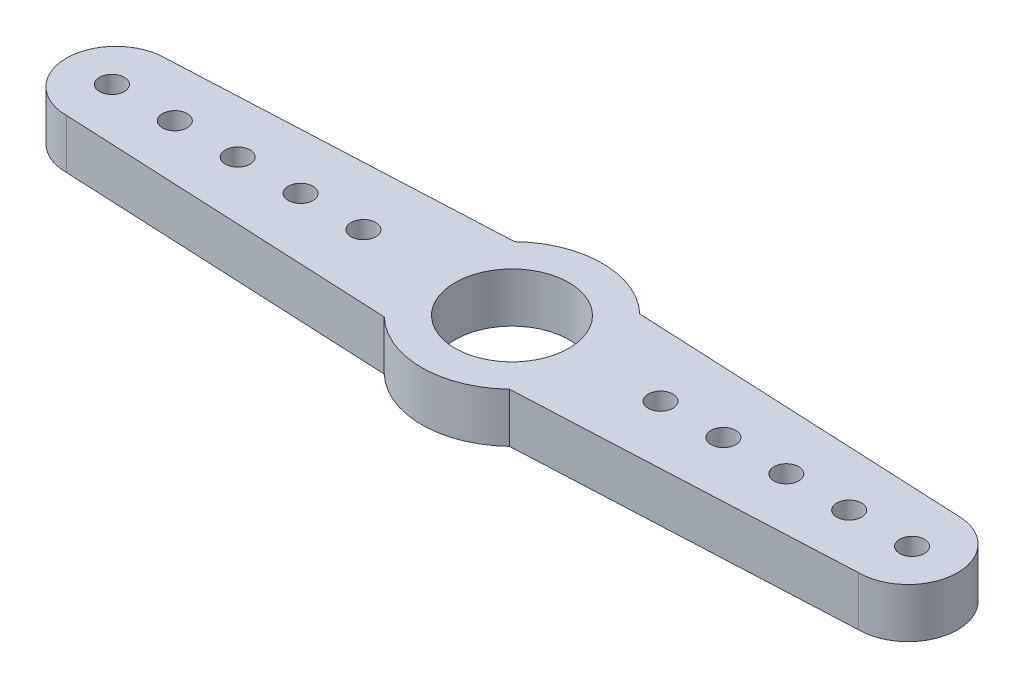
ISO-10303-21;
HEADER;
FILE_DESCRIPTION(('STEP AP214'),'2;1');
FILE_NAME('part.step','',(''),(''),'','','');
FILE_SCHEMA(('AUTOMOTIVE_DESIGN { 1 0 10303 214 1 1 1 1 }'));
ENDSEC;
DATA;
#1=APPLICATION_CONTEXT('core data for automotive mechanical design processes');
#2=APPLICATION_PROTOCOL_DEFINITION('international standard','automotive_design',2000,#1);
#3=PRODUCT_CONTEXT('',#1,'mechanical');
#4=PRODUCT('Part','Part','',(#3));
#5=PRODUCT_RELATED_PRODUCT_CATEGORY('part','',(#4));
#6=PRODUCT_DEFINITION_FORMATION('','',#4);
#7=PRODUCT_DEFINITION_CONTEXT('part definition',#1,'design');
#8=PRODUCT_DEFINITION('design','',#6,#7);
#9=PRODUCT_DEFINITION_SHAPE('','',#8);
#10=(LENGTH_UNIT() NAMED_UNIT(*) SI_UNIT(.MILLI.,.METRE.));
#11=(NAMED_UNIT(*) PLANE_ANGLE_UNIT() SI_UNIT($,.RADIAN.));
#12=(NAMED_UNIT(*) SI_UNIT($,.STERADIAN.) SOLID_ANGLE_UNIT());
#13=UNCERTAINTY_MEASURE_WITH_UNIT(LENGTH_MEASURE(1.E-05),#10,'distance_accuracy_value','');
#14=(GEOMETRIC_REPRESENTATION_CONTEXT(3) GLOBAL_UNCERTAINTY_ASSIGNED_CONTEXT((#13)) GLOBAL_UNIT_ASSIGNED_CONTEXT((#10,
#11,#12)) REPRESENTATION_CONTEXT('',''));
#15=CARTESIAN_POINT('',(0.,0.,0.));
#16=DIRECTION('',(0.,0.,1.));
#17=DIRECTION('',(1.,0.,0.));
#18=AXIS2_PLACEMENT_3D('',#15,#16,#17);
#19=CARTESIAN_POINT('',(-16.,2.,0.));
#20=DIRECTION('',(0.,-1.,0.));
#21=DIRECTION('',(0.,0.,-1.));
#22=AXIS2_PLACEMENT_3D('',#19,#20,#21);
#23=PLANE('',#22);
#24=CARTESIAN_POINT('',(-16.,2.,0.));
#25=DIRECTION('',(0.,1.,0.));
#26=DIRECTION('',(0.,0.,-1.));
#27=AXIS2_PLACEMENT_3D('',#24,#25,#26);
#28=CIRCLE('',#27,2.);
#29=CARTESIAN_POINT('',(-16.,2.,-2.));
#30=VERTEX_POINT('',#29);
#31=CARTESIAN_POINT('',(-16.,2.,2.));
#32=VERTEX_POINT('',#31);
#33=EDGE_CURVE('E170',#30,#32,#28,.T.);
#34=ORIENTED_EDGE('',*,*,#33,.T.);
#35=DIRECTION('',(0.998899457110281,0.,0.0469028206485118));
#36=VECTOR('',#35,1.);
#37=CARTESIAN_POINT('',(-16.,2.,2.));
#38=LINE('',#37,#36);
#39=CARTESIAN_POINT('',(-2.52848651409341,2.,2.63254812723732));
#40=VERTEX_POINT('',#39);
#41=EDGE_CURVE('E106',#32,#40,#38,.T.);
#42=ORIENTED_EDGE('',*,*,#41,.T.);
#43=CARTESIAN_POINT('',(1.25171845544864E-09,2.,0.000200136997831595));
#44=DIRECTION('',(0.,1.,0.));
#45=DIRECTION('',(0.,0.,1.));
#46=AXIS2_PLACEMENT_3D('',#43,#44,#45);
#47=CIRCLE('',#46,3.65);
#48=CARTESIAN_POINT('',(2.52848651672551,2.,2.63254812711373));
#49=VERTEX_POINT('',#48);
#50=EDGE_CURVE('E191',#40,#49,#47,.T.);
#51=ORIENTED_EDGE('',*,*,#50,.T.);
#52=DIRECTION('',(0.998899457110281,0.,-0.0469028206485114));
#53=VECTOR('',#52,1.);
#54=CARTESIAN_POINT('',(2.52848651672551,2.,2.63254812711373));
#55=LINE('',#54,#53);
#56=CARTESIAN_POINT('',(16.,2.,2.));
#57=VERTEX_POINT('',#56);
#58=EDGE_CURVE('E205',#49,#57,#55,.T.);
#59=ORIENTED_EDGE('',*,*,#58,.T.);
#60=CARTESIAN_POINT('',(16.,2.,0.));
#61=DIRECTION('',(0.,1.,0.));
#62=DIRECTION('',(0.,0.,-1.));
#63=AXIS2_PLACEMENT_3D('',#60,#61,#62);
#64=CIRCLE('',#63,2.);
#65=CARTESIAN_POINT('',(16.,2.,-2.));
#66=VERTEX_POINT('',#65);
#67=EDGE_CURVE('E125',#57,#66,#64,.T.);
#68=ORIENTED_EDGE('',*,*,#67,.T.);
#69=DIRECTION('',(-0.998899457110281,0.,-0.0469028206485115));
#70=VECTOR('',#69,1.);
#71=CARTESIAN_POINT('',(16.,2.,-2.));
#72=LINE('',#71,#70);
#73=CARTESIAN_POINT('',(2.52804830674604,2.,-2.63256870304249));
#74=VERTEX_POINT('',#73);
#75=EDGE_CURVE('E119',#66,#74,#72,.T.);
#76=ORIENTED_EDGE('',*,*,#75,.T.);
#77=CARTESIAN_POINT('',(1.25171845544864E-09,2.,0.000200136997831595));
#78=DIRECTION('',(0.,1.,0.));
#79=DIRECTION('',(0.,0.,1.));
#80=AXIS2_PLACEMENT_3D('',#77,#78,#79);
#81=CIRCLE('',#80,3.65);
#82=CARTESIAN_POINT('',(-2.52804830411389,2.,-2.63256870316608));
#83=VERTEX_POINT('',#82);
#84=EDGE_CURVE('E123',#74,#83,#81,.T.);
#85=ORIENTED_EDGE('',*,*,#84,.T.);
#86=DIRECTION('',(-0.998899457110281,0.,0.0469028206485117));
#87=VECTOR('',#86,1.);
#88=CARTESIAN_POINT('',(-2.52804830411389,2.,-2.63256870316608));
#89=LINE('',#88,#87);
#90=EDGE_CURVE('E63',#83,#30,#89,.T.);
#91=ORIENTED_EDGE('',*,*,#90,.T.);
#92=EDGE_LOOP('',(#34,#42,#51,#59,#68,#76,#85,#91));
#93=FACE_BOUND('',#92,.T.);
#94=CARTESIAN_POINT('',(-13.62,2.,0.));
#95=DIRECTION('',(0.,1.,0.));
#96=DIRECTION('',(0.,0.,1.));
#97=AXIS2_PLACEMENT_3D('',#94,#95,#96);
#98=CIRCLE('',#97,0.499999999999999);
#99=CARTESIAN_POINT('',(-13.62,2.,0.499999999999999));
#100=VERTEX_POINT('',#99);
#101=EDGE_CURVE('E152',#100,#100,#98,.T.);
#102=ORIENTED_EDGE('',*,*,#101,.F.);
#103=EDGE_LOOP('',(#102));
#104=FACE_BOUND('',#103,.T.);
#105=CARTESIAN_POINT('',(-8.54,2.,0.));
#106=DIRECTION('',(0.,1.,0.));
#107=DIRECTION('',(0.,0.,1.));
#108=AXIS2_PLACEMENT_3D('',#105,#106,#107);
#109=CIRCLE('',#108,0.500000000000001);
#110=CARTESIAN_POINT('',(-8.54,2.,0.500000000000001));
#111=VERTEX_POINT('',#110);
#112=EDGE_CURVE('E219',#111,#111,#109,.T.);
#113=ORIENTED_EDGE('',*,*,#112,.F.);
#114=EDGE_LOOP('',(#113));
#115=FACE_BOUND('',#114,.T.);
#116=CARTESIAN_POINT('',(-6.,2.,0.));
#117=DIRECTION('',(0.,1.,0.));
#118=DIRECTION('',(0.,0.,1.));
#119=AXIS2_PLACEMENT_3D('',#116,#117,#118);
#120=CIRCLE('',#119,0.5);
#121=CARTESIAN_POINT('',(-6.,2.,0.5));
#122=VERTEX_POINT('',#121);
#123=EDGE_CURVE('E227',#122,#122,#120,.T.);
#124=ORIENTED_EDGE('',*,*,#123,.F.);
#125=EDGE_LOOP('',(#124));
#126=FACE_BOUND('',#125,.T.);
#127=CARTESIAN_POINT('',(-11.08,2.,0.));
#128=DIRECTION('',(0.,1.,0.));
#129=DIRECTION('',(0.,0.,1.));
#130=AXIS2_PLACEMENT_3D('',#127,#128,#129);
#131=CIRCLE('',#130,0.500000000000001);
#132=CARTESIAN_POINT('',(-11.08,2.,0.500000000000001));
#133=VERTEX_POINT('',#132);
#134=EDGE_CURVE('E235',#133,#133,#131,.T.);
#135=ORIENTED_EDGE('',*,*,#134,.F.);
#136=EDGE_LOOP('',(#135));
#137=FACE_BOUND('',#136,.T.);
#138=CARTESIAN_POINT('',(-16.16,2.,0.));
#139=DIRECTION('',(0.,1.,0.));
#140=DIRECTION('',(0.,0.,1.));
#141=AXIS2_PLACEMENT_3D('',#138,#139,#140);
#142=CIRCLE('',#141,0.499999999999996);
#143=CARTESIAN_POINT('',(-16.16,2.,0.499999999999996));
#144=VERTEX_POINT('',#143);
#145=EDGE_CURVE('E243',#144,#144,#142,.T.);
#146=ORIENTED_EDGE('',*,*,#145,.F.);
#147=EDGE_LOOP('',(#146));
#148=FACE_BOUND('',#147,.T.);
#149=CARTESIAN_POINT('',(16.16,2.,0.));
#150=DIRECTION('',(0.,1.,0.));
#151=DIRECTION('',(0.,0.,-1.));
#152=AXIS2_PLACEMENT_3D('',#149,#150,#151);
#153=CIRCLE('',#152,0.500000000000006);
#154=CARTESIAN_POINT('',(16.16,2.,-0.500000000000006));
#155=VERTEX_POINT('',#154);
#156=EDGE_CURVE('E251',#155,#155,#153,.T.);
#157=ORIENTED_EDGE('',*,*,#156,.F.);
#158=EDGE_LOOP('',(#157));
#159=FACE_BOUND('',#158,.T.);
#160=CARTESIAN_POINT('',(13.62,2.,0.));
#161=DIRECTION('',(0.,1.,0.));
#162=DIRECTION('',(0.,0.,-1.));
#163=AXIS2_PLACEMENT_3D('',#160,#161,#162);
#164=CIRCLE('',#163,0.499999999999999);
#165=CARTESIAN_POINT('',(13.62,2.,-0.499999999999999));
#166=VERTEX_POINT('',#165);
#167=EDGE_CURVE('E259',#166,#166,#164,.T.);
#168=ORIENTED_EDGE('',*,*,#167,.F.);
#169=EDGE_LOOP('',(#168));
#170=FACE_BOUND('',#169,.T.);
#171=CARTESIAN_POINT('',(11.08,2.,0.));
#172=DIRECTION('',(0.,1.,0.));
#173=DIRECTION('',(0.,0.,-1.));
#174=AXIS2_PLACEMENT_3D('',#171,#172,#173);
#175=CIRCLE('',#174,0.500000000000001);
#176=CARTESIAN_POINT('',(11.08,2.,-0.500000000000001));
#177=VERTEX_POINT('',#176);
#178=EDGE_CURVE('E267',#177,#177,#175,.T.);
#179=ORIENTED_EDGE('',*,*,#178,.F.);
#180=EDGE_LOOP('',(#179));
#181=FACE_BOUND('',#180,.T.);
#182=CARTESIAN_POINT('',(8.54,2.,0.));
#183=DIRECTION('',(0.,1.,0.));
#184=DIRECTION('',(0.,0.,-1.));
#185=AXIS2_PLACEMENT_3D('',#182,#183,#184);
#186=CIRCLE('',#185,0.500000000000001);
#187=CARTESIAN_POINT('',(8.54,2.,-0.500000000000001));
#188=VERTEX_POINT('',#187);
#189=EDGE_CURVE('E275',#188,#188,#186,.T.);
#190=ORIENTED_EDGE('',*,*,#189,.F.);
#191=EDGE_LOOP('',(#190));
#192=FACE_BOUND('',#191,.T.);
#193=CARTESIAN_POINT('',(6.,2.,0.));
#194=DIRECTION('',(0.,1.,0.));
#195=DIRECTION('',(0.,0.,-1.));
#196=AXIS2_PLACEMENT_3D('',#193,#194,#195);
#197=CIRCLE('',#196,0.5);
#198=CARTESIAN_POINT('',(6.,2.,-0.5));
#199=VERTEX_POINT('',#198);
#200=EDGE_CURVE('E283',#199,#199,#197,.T.);
#201=ORIENTED_EDGE('',*,*,#200,.F.);
#202=EDGE_LOOP('',(#201));
#203=FACE_BOUND('',#202,.T.);
#204=CARTESIAN_POINT('',(0.,2.,0.));
#205=DIRECTION('',(0.,1.,0.));
#206=DIRECTION('',(0.,0.,1.));
#207=AXIS2_PLACEMENT_3D('',#204,#205,#206);
#208=CIRCLE('',#207,2.30000000000001);
#209=CARTESIAN_POINT('',(0.,2.,2.30000000000001));
#210=VERTEX_POINT('',#209);
#211=EDGE_CURVE('E291',#210,#210,#208,.T.);
#212=ORIENTED_EDGE('',*,*,#211,.F.);
#213=EDGE_LOOP('',(#212));
#214=FACE_BOUND('',#213,.T.);
#215=ADVANCED_FACE('F45',(#93,#104,#115,#126,#137,#148,#159,#170,#181,#192,#203,#214),#23,.F.);
#216=CARTESIAN_POINT('',(-16.,0.,0.));
#217=DIRECTION('',(0.,-1.,0.));
#218=DIRECTION('',(0.,0.,-1.));
#219=AXIS2_PLACEMENT_3D('',#216,#217,#218);
#220=PLANE('',#219);
#221=CARTESIAN_POINT('',(6.,0.,0.));
#222=DIRECTION('',(0.,1.,0.));
#223=DIRECTION('',(0.,0.,-1.));
#224=AXIS2_PLACEMENT_3D('',#221,#222,#223);
#225=CIRCLE('',#224,0.5);
#226=CARTESIAN_POINT('',(6.,0.,-0.5));
#227=VERTEX_POINT('',#226);
#228=EDGE_CURVE('E287',#227,#227,#225,.T.);
#229=ORIENTED_EDGE('',*,*,#228,.T.);
#230=EDGE_LOOP('',(#229));
#231=FACE_BOUND('',#230,.T.);
#232=CARTESIAN_POINT('',(11.08,0.,0.));
#233=DIRECTION('',(0.,1.,0.));
#234=DIRECTION('',(0.,0.,-1.));
#235=AXIS2_PLACEMENT_3D('',#232,#233,#234);
#236=CIRCLE('',#235,0.500000000000001);
#237=CARTESIAN_POINT('',(11.08,0.,-0.500000000000001));
#238=VERTEX_POINT('',#237);
#239=EDGE_CURVE('E271',#238,#238,#236,.T.);
#240=ORIENTED_EDGE('',*,*,#239,.T.);
#241=EDGE_LOOP('',(#240));
#242=FACE_BOUND('',#241,.T.);
#243=CARTESIAN_POINT('',(16.16,0.,0.));
#244=DIRECTION('',(0.,1.,0.));
#245=DIRECTION('',(0.,0.,-1.));
#246=AXIS2_PLACEMENT_3D('',#243,#244,#245);
#247=CIRCLE('',#246,0.500000000000006);
#248=CARTESIAN_POINT('',(16.16,0.,-0.500000000000006));
#249=VERTEX_POINT('',#248);
#250=EDGE_CURVE('E255',#249,#249,#247,.T.);
#251=ORIENTED_EDGE('',*,*,#250,.T.);
#252=EDGE_LOOP('',(#251));
#253=FACE_BOUND('',#252,.T.);
#254=CARTESIAN_POINT('',(-11.08,0.,0.));
#255=DIRECTION('',(0.,1.,0.));
#256=DIRECTION('',(0.,0.,1.));
#257=AXIS2_PLACEMENT_3D('',#254,#255,#256);
#258=CIRCLE('',#257,0.500000000000001);
#259=CARTESIAN_POINT('',(-11.08,0.,0.500000000000001));
#260=VERTEX_POINT('',#259);
#261=EDGE_CURVE('E239',#260,#260,#258,.T.);
#262=ORIENTED_EDGE('',*,*,#261,.T.);
#263=EDGE_LOOP('',(#262));
#264=FACE_BOUND('',#263,.T.);
#265=CARTESIAN_POINT('',(-8.54,0.,0.));
#266=DIRECTION('',(0.,1.,0.));
#267=DIRECTION('',(0.,0.,1.));
#268=AXIS2_PLACEMENT_3D('',#265,#266,#267);
#269=CIRCLE('',#268,0.500000000000001);
#270=CARTESIAN_POINT('',(-8.54,0.,0.500000000000001));
#271=VERTEX_POINT('',#270);
#272=EDGE_CURVE('E223',#271,#271,#269,.T.);
#273=ORIENTED_EDGE('',*,*,#272,.T.);
#274=EDGE_LOOP('',(#273));
#275=FACE_BOUND('',#274,.T.);
#276=CARTESIAN_POINT('',(-16.,0.,0.));
#277=DIRECTION('',(0.,1.,0.));
#278=DIRECTION('',(0.,0.,-1.));
#279=AXIS2_PLACEMENT_3D('',#276,#277,#278);
#280=CIRCLE('',#279,2.);
#281=CARTESIAN_POINT('',(-16.,0.,-2.));
#282=VERTEX_POINT('',#281);
#283=CARTESIAN_POINT('',(-16.,0.,2.));
#284=VERTEX_POINT('',#283);
#285=EDGE_CURVE('E147',#282,#284,#280,.T.);
#286=ORIENTED_EDGE('',*,*,#285,.F.);
#287=DIRECTION('',(-0.998899457110281,0.,0.0469028206485117));
#288=VECTOR('',#287,1.);
#289=CARTESIAN_POINT('',(-2.52804830411389,0.,-2.63256870316608));
#290=LINE('',#289,#288);
#291=CARTESIAN_POINT('',(-2.52804830411389,0.,-2.63256870316608));
#292=VERTEX_POINT('',#291);
#293=EDGE_CURVE('E98',#292,#282,#290,.T.);
#294=ORIENTED_EDGE('',*,*,#293,.F.);
#295=CARTESIAN_POINT('',(1.25171845544864E-09,0.,0.000200136997831595));
#296=DIRECTION('',(0.,1.,0.));
#297=DIRECTION('',(0.,0.,1.));
#298=AXIS2_PLACEMENT_3D('',#295,#296,#297);
#299=CIRCLE('',#298,3.65);
#300=CARTESIAN_POINT('',(2.52804830674604,0.,-2.63256870304249));
#301=VERTEX_POINT('',#300);
#302=EDGE_CURVE('E92',#301,#292,#299,.T.);
#303=ORIENTED_EDGE('',*,*,#302,.F.);
#304=DIRECTION('',(-0.998899457110281,0.,-0.0469028206485115));
#305=VECTOR('',#304,1.);
#306=CARTESIAN_POINT('',(16.,0.,-2.));
#307=LINE('',#306,#305);
#308=CARTESIAN_POINT('',(16.,0.,-2.));
#309=VERTEX_POINT('',#308);
#310=EDGE_CURVE('E134',#309,#301,#307,.T.);
#311=ORIENTED_EDGE('',*,*,#310,.F.);
#312=CARTESIAN_POINT('',(16.,0.,0.));
#313=DIRECTION('',(0.,1.,0.));
#314=DIRECTION('',(0.,0.,-1.));
#315=AXIS2_PLACEMENT_3D('',#312,#313,#314);
#316=CIRCLE('',#315,2.);
#317=CARTESIAN_POINT('',(16.,0.,2.));
#318=VERTEX_POINT('',#317);
#319=EDGE_CURVE('E161',#318,#309,#316,.T.);
#320=ORIENTED_EDGE('',*,*,#319,.F.);
#321=DIRECTION('',(0.998899457110281,0.,-0.0469028206485114));
#322=VECTOR('',#321,1.);
#323=CARTESIAN_POINT('',(2.52848651672551,0.,2.63254812711373));
#324=LINE('',#323,#322);
#325=CARTESIAN_POINT('',(2.52848651672551,0.,2.63254812711373));
#326=VERTEX_POINT('',#325);
#327=EDGE_CURVE('E158',#326,#318,#324,.T.);
#328=ORIENTED_EDGE('',*,*,#327,.F.);
#329=CARTESIAN_POINT('',(1.25171845544864E-09,0.,0.000200136997831595));
#330=DIRECTION('',(0.,1.,0.));
#331=DIRECTION('',(0.,0.,1.));
#332=AXIS2_PLACEMENT_3D('',#329,#330,#331);
#333=CIRCLE('',#332,3.65);
#334=CARTESIAN_POINT('',(-2.52848651409341,0.,2.63254812723732));
#335=VERTEX_POINT('',#334);
#336=EDGE_CURVE('E155',#335,#326,#333,.T.);
#337=ORIENTED_EDGE('',*,*,#336,.F.);
#338=DIRECTION('',(0.998899457110281,0.,0.0469028206485118));
#339=VECTOR('',#338,1.);
#340=CARTESIAN_POINT('',(-16.,0.,2.));
#341=LINE('',#340,#339);
#342=EDGE_CURVE('E151',#284,#335,#341,.T.);
#343=ORIENTED_EDGE('',*,*,#342,.F.);
#344=EDGE_LOOP('',(#286,#294,#303,#311,#320,#328,#337,#343));
#345=FACE_BOUND('',#344,.T.);
#346=CARTESIAN_POINT('',(-13.62,0.,0.));
#347=DIRECTION('',(0.,1.,0.));
#348=DIRECTION('',(0.,0.,1.));
#349=AXIS2_PLACEMENT_3D('',#346,#347,#348);
#350=CIRCLE('',#349,0.499999999999999);
#351=CARTESIAN_POINT('',(-13.62,0.,0.499999999999999));
#352=VERTEX_POINT('',#351);
#353=EDGE_CURVE('E215',#352,#352,#350,.T.);
#354=ORIENTED_EDGE('',*,*,#353,.T.);
#355=EDGE_LOOP('',(#354));
#356=FACE_BOUND('',#355,.T.);
#357=CARTESIAN_POINT('',(-6.,0.,0.));
#358=DIRECTION('',(0.,1.,0.));
#359=DIRECTION('',(0.,0.,1.));
#360=AXIS2_PLACEMENT_3D('',#357,#358,#359);
#361=CIRCLE('',#360,0.5);
#362=CARTESIAN_POINT('',(-6.,0.,0.5));
#363=VERTEX_POINT('',#362);
#364=EDGE_CURVE('E231',#363,#363,#361,.T.);
#365=ORIENTED_EDGE('',*,*,#364,.T.);
#366=EDGE_LOOP('',(#365));
#367=FACE_BOUND('',#366,.T.);
#368=CARTESIAN_POINT('',(-16.16,0.,0.));
#369=DIRECTION('',(0.,1.,0.));
#370=DIRECTION('',(0.,0.,1.));
#371=AXIS2_PLACEMENT_3D('',#368,#369,#370);
#372=CIRCLE('',#371,0.499999999999996);
#373=CARTESIAN_POINT('',(-16.16,0.,0.499999999999996));
#374=VERTEX_POINT('',#373);
#375=EDGE_CURVE('E247',#374,#374,#372,.T.);
#376=ORIENTED_EDGE('',*,*,#375,.T.);
#377=EDGE_LOOP('',(#376));
#378=FACE_BOUND('',#377,.T.);
#379=CARTESIAN_POINT('',(13.62,0.,0.));
#380=DIRECTION('',(0.,1.,0.));
#381=DIRECTION('',(0.,0.,-1.));
#382=AXIS2_PLACEMENT_3D('',#379,#380,#381);
#383=CIRCLE('',#382,0.499999999999999);
#384=CARTESIAN_POINT('',(13.62,0.,-0.499999999999999));
#385=VERTEX_POINT('',#384);
#386=EDGE_CURVE('E263',#385,#385,#383,.T.);
#387=ORIENTED_EDGE('',*,*,#386,.T.);
#388=EDGE_LOOP('',(#387));
#389=FACE_BOUND('',#388,.T.);
#390=CARTESIAN_POINT('',(8.54,0.,0.));
#391=DIRECTION('',(0.,1.,0.));
#392=DIRECTION('',(0.,0.,-1.));
#393=AXIS2_PLACEMENT_3D('',#390,#391,#392);
#394=CIRCLE('',#393,0.500000000000001);
#395=CARTESIAN_POINT('',(8.54,0.,-0.500000000000001));
#396=VERTEX_POINT('',#395);
#397=EDGE_CURVE('E279',#396,#396,#394,.T.);
#398=ORIENTED_EDGE('',*,*,#397,.T.);
#399=EDGE_LOOP('',(#398));
#400=FACE_BOUND('',#399,.T.);
#401=CARTESIAN_POINT('',(0.,0.,0.));
#402=DIRECTION('',(0.,1.,0.));
#403=DIRECTION('',(0.,0.,1.));
#404=AXIS2_PLACEMENT_3D('',#401,#402,#403);
#405=CIRCLE('',#404,2.30000000000001);
#406=CARTESIAN_POINT('',(0.,0.,2.30000000000001));
#407=VERTEX_POINT('',#406);
#408=EDGE_CURVE('E295',#407,#407,#405,.T.);
#409=ORIENTED_EDGE('',*,*,#408,.T.);
#410=EDGE_LOOP('',(#409));
#411=FACE_BOUND('',#410,.T.);
#412=ADVANCED_FACE('F195',(#231,#242,#253,#264,#275,#345,#356,#367,#378,#389,#400,#411),#220,.T.);
#413=CARTESIAN_POINT('',(-16.,2.,0.));
#414=DIRECTION('',(0.,-1.,0.));
#415=DIRECTION('',(0.,0.,-1.));
#416=AXIS2_PLACEMENT_3D('',#413,#414,#415);
#417=CYLINDRICAL_SURFACE('',#416,2.);
#418=ORIENTED_EDGE('',*,*,#285,.T.);
#419=DIRECTION('',(0.,-1.,0.));
#420=VECTOR('',#419,1.);
#421=CARTESIAN_POINT('',(-16.,2.,2.));
#422=LINE('',#421,#420);
#423=EDGE_CURVE('E11',#32,#284,#422,.T.);
#424=ORIENTED_EDGE('',*,*,#423,.F.);
#425=ORIENTED_EDGE('',*,*,#33,.F.);
#426=DIRECTION('',(0.,-1.,0.));
#427=VECTOR('',#426,1.);
#428=CARTESIAN_POINT('',(-16.,2.,-2.));
#429=LINE('',#428,#427);
#430=EDGE_CURVE('E143',#30,#282,#429,.T.);
#431=ORIENTED_EDGE('',*,*,#430,.T.);
#432=EDGE_LOOP('',(#418,#424,#425,#431));
#433=FACE_BOUND('',#432,.T.);
#434=ADVANCED_FACE('F47',(#433),#417,.T.);
#435=CARTESIAN_POINT('',(-16.,2.,2.));
#436=DIRECTION('',(0.0469028206485118,0.,-0.998899457110281));
#437=DIRECTION('',(-0.998899457110281,0.,-0.0469028206485118));
#438=AXIS2_PLACEMENT_3D('',#435,#436,#437);
#439=PLANE('',#438);
#440=ORIENTED_EDGE('',*,*,#342,.T.);
#441=DIRECTION('',(0.,-1.,0.));
#442=VECTOR('',#441,1.);
#443=CARTESIAN_POINT('',(-2.52848651409341,2.,2.63254812723732));
#444=LINE('',#443,#442);
#445=EDGE_CURVE('E55',#40,#335,#444,.T.);
#446=ORIENTED_EDGE('',*,*,#445,.F.);
#447=ORIENTED_EDGE('',*,*,#41,.F.);
#448=ORIENTED_EDGE('',*,*,#423,.T.);
#449=EDGE_LOOP('',(#440,#446,#447,#448));
#450=FACE_BOUND('',#449,.T.);
#451=ADVANCED_FACE('F329',(#450),#439,.F.);
#452=CARTESIAN_POINT('',(1.25171845544864E-09,2.,0.000200136997831595));
#453=DIRECTION('',(0.,-1.,0.));
#454=DIRECTION('',(0.,0.,-1.));
#455=AXIS2_PLACEMENT_3D('',#452,#453,#454);
#456=CYLINDRICAL_SURFACE('',#455,3.65);
#457=ORIENTED_EDGE('',*,*,#336,.T.);
#458=DIRECTION('',(0.,-1.,0.));
#459=VECTOR('',#458,1.);
#460=CARTESIAN_POINT('',(2.52848651672551,2.,2.63254812711373));
#461=LINE('',#460,#459);
#462=EDGE_CURVE('E181',#49,#326,#461,.T.);
#463=ORIENTED_EDGE('',*,*,#462,.F.);
#464=ORIENTED_EDGE('',*,*,#50,.F.);
#465=ORIENTED_EDGE('',*,*,#445,.T.);
#466=EDGE_LOOP('',(#457,#463,#464,#465));
#467=FACE_BOUND('',#466,.T.);
#468=ADVANCED_FACE('F189',(#467),#456,.T.);
#469=CARTESIAN_POINT('',(2.52848651672551,2.,2.63254812711373));
#470=DIRECTION('',(-0.0469028206485114,0.,-0.998899457110281));
#471=DIRECTION('',(-0.998899457110281,0.,0.0469028206485114));
#472=AXIS2_PLACEMENT_3D('',#469,#470,#471);
#473=PLANE('',#472);
#474=ORIENTED_EDGE('',*,*,#327,.T.);
#475=DIRECTION('',(0.,-1.,0.));
#476=VECTOR('',#475,1.);
#477=CARTESIAN_POINT('',(16.,2.,2.));
#478=LINE('',#477,#476);
#479=EDGE_CURVE('E177',#57,#318,#478,.T.);
#480=ORIENTED_EDGE('',*,*,#479,.F.);
#481=ORIENTED_EDGE('',*,*,#58,.F.);
#482=ORIENTED_EDGE('',*,*,#462,.T.);
#483=EDGE_LOOP('',(#474,#480,#481,#482));
#484=FACE_BOUND('',#483,.T.);
#485=ADVANCED_FACE('F200',(#484),#473,.F.);
#486=CARTESIAN_POINT('',(16.,2.,0.));
#487=DIRECTION('',(0.,-1.,0.));
#488=DIRECTION('',(0.,0.,-1.));
#489=AXIS2_PLACEMENT_3D('',#486,#487,#488);
#490=CYLINDRICAL_SURFACE('',#489,2.);
#491=ORIENTED_EDGE('',*,*,#319,.T.);
#492=DIRECTION('',(0.,-1.,0.));
#493=VECTOR('',#492,1.);
#494=CARTESIAN_POINT('',(16.,2.,-2.));
#495=LINE('',#494,#493);
#496=EDGE_CURVE('E136',#66,#309,#495,.T.);
#497=ORIENTED_EDGE('',*,*,#496,.F.);
#498=ORIENTED_EDGE('',*,*,#67,.F.);
#499=ORIENTED_EDGE('',*,*,#479,.T.);
#500=EDGE_LOOP('',(#491,#497,#498,#499));
#501=FACE_BOUND('',#500,.T.);
#502=ADVANCED_FACE('F203',(#501),#490,.T.);
#503=CARTESIAN_POINT('',(16.,2.,-2.));
#504=DIRECTION('',(-0.0469028206485115,0.,0.998899457110281));
#505=DIRECTION('',(0.998899457110281,0.,0.0469028206485115));
#506=AXIS2_PLACEMENT_3D('',#503,#504,#505);
#507=PLANE('',#506);
#508=ORIENTED_EDGE('',*,*,#310,.T.);
#509=DIRECTION('',(0.,-1.,0.));
#510=VECTOR('',#509,1.);
#511=CARTESIAN_POINT('',(2.52804830674604,2.,-2.63256870304249));
#512=LINE('',#511,#510);
#513=EDGE_CURVE('E131',#74,#301,#512,.T.);
#514=ORIENTED_EDGE('',*,*,#513,.F.);
#515=ORIENTED_EDGE('',*,*,#75,.F.);
#516=ORIENTED_EDGE('',*,*,#496,.T.);
#517=EDGE_LOOP('',(#508,#514,#515,#516));
#518=FACE_BOUND('',#517,.T.);
#519=ADVANCED_FACE('F132',(#518),#507,.F.);
#520=CARTESIAN_POINT('',(1.25171845544864E-09,2.,0.000200136997831595));
#521=DIRECTION('',(0.,-1.,0.));
#522=DIRECTION('',(0.,0.,-1.));
#523=AXIS2_PLACEMENT_3D('',#520,#521,#522);
#524=CYLINDRICAL_SURFACE('',#523,3.65);
#525=ORIENTED_EDGE('',*,*,#302,.T.);
#526=DIRECTION('',(0.,-1.,0.));
#527=VECTOR('',#526,1.);
#528=CARTESIAN_POINT('',(-2.52804830411389,2.,-2.63256870316608));
#529=LINE('',#528,#527);
#530=EDGE_CURVE('E137',#83,#292,#529,.T.);
#531=ORIENTED_EDGE('',*,*,#530,.F.);
#532=ORIENTED_EDGE('',*,*,#84,.F.);
#533=ORIENTED_EDGE('',*,*,#513,.T.);
#534=EDGE_LOOP('',(#525,#531,#532,#533));
#535=FACE_BOUND('',#534,.T.);
#536=ADVANCED_FACE('F139',(#535),#524,.T.);
#537=CARTESIAN_POINT('',(-2.52804830411389,2.,-2.63256870316608));
#538=DIRECTION('',(0.0469028206485117,0.,0.998899457110281));
#539=DIRECTION('',(0.998899457110281,0.,-0.0469028206485117));
#540=AXIS2_PLACEMENT_3D('',#537,#538,#539);
#541=PLANE('',#540);
#542=ORIENTED_EDGE('',*,*,#293,.T.);
#543=ORIENTED_EDGE('',*,*,#430,.F.);
#544=ORIENTED_EDGE('',*,*,#90,.F.);
#545=ORIENTED_EDGE('',*,*,#530,.T.);
#546=EDGE_LOOP('',(#542,#543,#544,#545));
#547=FACE_BOUND('',#546,.T.);
#548=ADVANCED_FACE('F317',(#547),#541,.F.);
#549=CARTESIAN_POINT('',(-13.62,2.,0.));
#550=DIRECTION('',(0.,-1.,0.));
#551=DIRECTION('',(0.,0.,-1.));
#552=AXIS2_PLACEMENT_3D('',#549,#550,#551);
#553=CYLINDRICAL_SURFACE('',#552,0.499999999999999);
#554=ORIENTED_EDGE('',*,*,#101,.T.);
#555=EDGE_LOOP('',(#554));
#556=FACE_BOUND('',#555,.T.);
#557=ORIENTED_EDGE('',*,*,#353,.F.);
#558=EDGE_LOOP('',(#557));
#559=FACE_BOUND('',#558,.T.);
#560=ADVANCED_FACE('F314',(#556,#559),#553,.F.);
#561=CARTESIAN_POINT('',(-8.54,2.,0.));
#562=DIRECTION('',(0.,-1.,0.));
#563=DIRECTION('',(0.,0.,-1.));
#564=AXIS2_PLACEMENT_3D('',#561,#562,#563);
#565=CYLINDRICAL_SURFACE('',#564,0.500000000000001);
#566=ORIENTED_EDGE('',*,*,#112,.T.);
#567=EDGE_LOOP('',(#566));
#568=FACE_BOUND('',#567,.T.);
#569=ORIENTED_EDGE('',*,*,#272,.F.);
#570=EDGE_LOOP('',(#569));
#571=FACE_BOUND('',#570,.T.);
#572=ADVANCED_FACE('F392',(#568,#571),#565,.F.);
#573=CARTESIAN_POINT('',(-6.,2.,0.));
#574=DIRECTION('',(0.,-1.,0.));
#575=DIRECTION('',(0.,0.,-1.));
#576=AXIS2_PLACEMENT_3D('',#573,#574,#575);
#577=CYLINDRICAL_SURFACE('',#576,0.5);
#578=ORIENTED_EDGE('',*,*,#123,.T.);
#579=EDGE_LOOP('',(#578));
#580=FACE_BOUND('',#579,.T.);
#581=ORIENTED_EDGE('',*,*,#364,.F.);
#582=EDGE_LOOP('',(#581));
#583=FACE_BOUND('',#582,.T.);
#584=ADVANCED_FACE('F400',(#580,#583),#577,.F.);
#585=CARTESIAN_POINT('',(-11.08,2.,0.));
#586=DIRECTION('',(0.,-1.,0.));
#587=DIRECTION('',(0.,0.,-1.));
#588=AXIS2_PLACEMENT_3D('',#585,#586,#587);
#589=CYLINDRICAL_SURFACE('',#588,0.500000000000001);
#590=ORIENTED_EDGE('',*,*,#134,.T.);
#591=EDGE_LOOP('',(#590));
#592=FACE_BOUND('',#591,.T.);
#593=ORIENTED_EDGE('',*,*,#261,.F.);
#594=EDGE_LOOP('',(#593));
#595=FACE_BOUND('',#594,.T.);
#596=ADVANCED_FACE('F408',(#592,#595),#589,.F.);
#597=CARTESIAN_POINT('',(-16.16,2.,0.));
#598=DIRECTION('',(0.,-1.,0.));
#599=DIRECTION('',(0.,0.,-1.));
#600=AXIS2_PLACEMENT_3D('',#597,#598,#599);
#601=CYLINDRICAL_SURFACE('',#600,0.499999999999996);
#602=ORIENTED_EDGE('',*,*,#145,.T.);
#603=EDGE_LOOP('',(#602));
#604=FACE_BOUND('',#603,.T.);
#605=ORIENTED_EDGE('',*,*,#375,.F.);
#606=EDGE_LOOP('',(#605));
#607=FACE_BOUND('',#606,.T.);
#608=ADVANCED_FACE('F417',(#604,#607),#601,.F.);
#609=CARTESIAN_POINT('',(16.16,2.,0.));
#610=DIRECTION('',(0.,-1.,0.));
#611=DIRECTION('',(0.,0.,-1.));
#612=AXIS2_PLACEMENT_3D('',#609,#610,#611);
#613=CYLINDRICAL_SURFACE('',#612,0.500000000000006);
#614=ORIENTED_EDGE('',*,*,#156,.T.);
#615=EDGE_LOOP('',(#614));
#616=FACE_BOUND('',#615,.T.);
#617=ORIENTED_EDGE('',*,*,#250,.F.);
#618=EDGE_LOOP('',(#617));
#619=FACE_BOUND('',#618,.T.);
#620=ADVANCED_FACE('F426',(#616,#619),#613,.F.);
#621=CARTESIAN_POINT('',(13.62,2.,0.));
#622=DIRECTION('',(0.,-1.,0.));
#623=DIRECTION('',(0.,0.,-1.));
#624=AXIS2_PLACEMENT_3D('',#621,#622,#623);
#625=CYLINDRICAL_SURFACE('',#624,0.499999999999999);
#626=ORIENTED_EDGE('',*,*,#167,.T.);
#627=EDGE_LOOP('',(#626));
#628=FACE_BOUND('',#627,.T.);
#629=ORIENTED_EDGE('',*,*,#386,.F.);
#630=EDGE_LOOP('',(#629));
#631=FACE_BOUND('',#630,.T.);
#632=ADVANCED_FACE('F435',(#628,#631),#625,.F.);
#633=CARTESIAN_POINT('',(11.08,2.,0.));
#634=DIRECTION('',(0.,-1.,0.));
#635=DIRECTION('',(0.,0.,-1.));
#636=AXIS2_PLACEMENT_3D('',#633,#634,#635);
#637=CYLINDRICAL_SURFACE('',#636,0.500000000000001);
#638=ORIENTED_EDGE('',*,*,#178,.T.);
#639=EDGE_LOOP('',(#638));
#640=FACE_BOUND('',#639,.T.);
#641=ORIENTED_EDGE('',*,*,#239,.F.);
#642=EDGE_LOOP('',(#641));
#643=FACE_BOUND('',#642,.T.);
#644=ADVANCED_FACE('F444',(#640,#643),#637,.F.);
#645=CARTESIAN_POINT('',(8.54,2.,0.));
#646=DIRECTION('',(0.,-1.,0.));
#647=DIRECTION('',(0.,0.,-1.));
#648=AXIS2_PLACEMENT_3D('',#645,#646,#647);
#649=CYLINDRICAL_SURFACE('',#648,0.500000000000001);
#650=ORIENTED_EDGE('',*,*,#189,.T.);
#651=EDGE_LOOP('',(#650));
#652=FACE_BOUND('',#651,.T.);
#653=ORIENTED_EDGE('',*,*,#397,.F.);
#654=EDGE_LOOP('',(#653));
#655=FACE_BOUND('',#654,.T.);
#656=ADVANCED_FACE('F453',(#652,#655),#649,.F.);
#657=CARTESIAN_POINT('',(6.,2.,0.));
#658=DIRECTION('',(0.,-1.,0.));
#659=DIRECTION('',(0.,0.,-1.));
#660=AXIS2_PLACEMENT_3D('',#657,#658,#659);
#661=CYLINDRICAL_SURFACE('',#660,0.5);
#662=ORIENTED_EDGE('',*,*,#200,.T.);
#663=EDGE_LOOP('',(#662));
#664=FACE_BOUND('',#663,.T.);
#665=ORIENTED_EDGE('',*,*,#228,.F.);
#666=EDGE_LOOP('',(#665));
#667=FACE_BOUND('',#666,.T.);
#668=ADVANCED_FACE('F462',(#664,#667),#661,.F.);
#669=CARTESIAN_POINT('',(0.,2.,0.));
#670=DIRECTION('',(0.,-1.,0.));
#671=DIRECTION('',(0.,0.,-1.));
#672=AXIS2_PLACEMENT_3D('',#669,#670,#671);
#673=CYLINDRICAL_SURFACE('',#672,2.30000000000001);
#674=ORIENTED_EDGE('',*,*,#211,.T.);
#675=EDGE_LOOP('',(#674));
#676=FACE_BOUND('',#675,.T.);
#677=ORIENTED_EDGE('',*,*,#408,.F.);
#678=EDGE_LOOP('',(#677));
#679=FACE_BOUND('',#678,.T.);
#680=ADVANCED_FACE('F303',(#676,#679),#673,.F.);
#681=CLOSED_SHELL('',(#215,#412,#434,#451,#468,#485,#502,#519,#536,#548,#560,#572,#584,#596,
#608,#620,#632,#644,#656,#668,#680));
#682=MANIFOLD_SOLID_BREP('B2',#681);
#683=ADVANCED_BREP_SHAPE_REPRESENTATION('',(#18,#682),#14);
#684=SHAPE_DEFINITION_REPRESENTATION(#9,#683);
ENDSEC;
END-ISO-10303-21;
